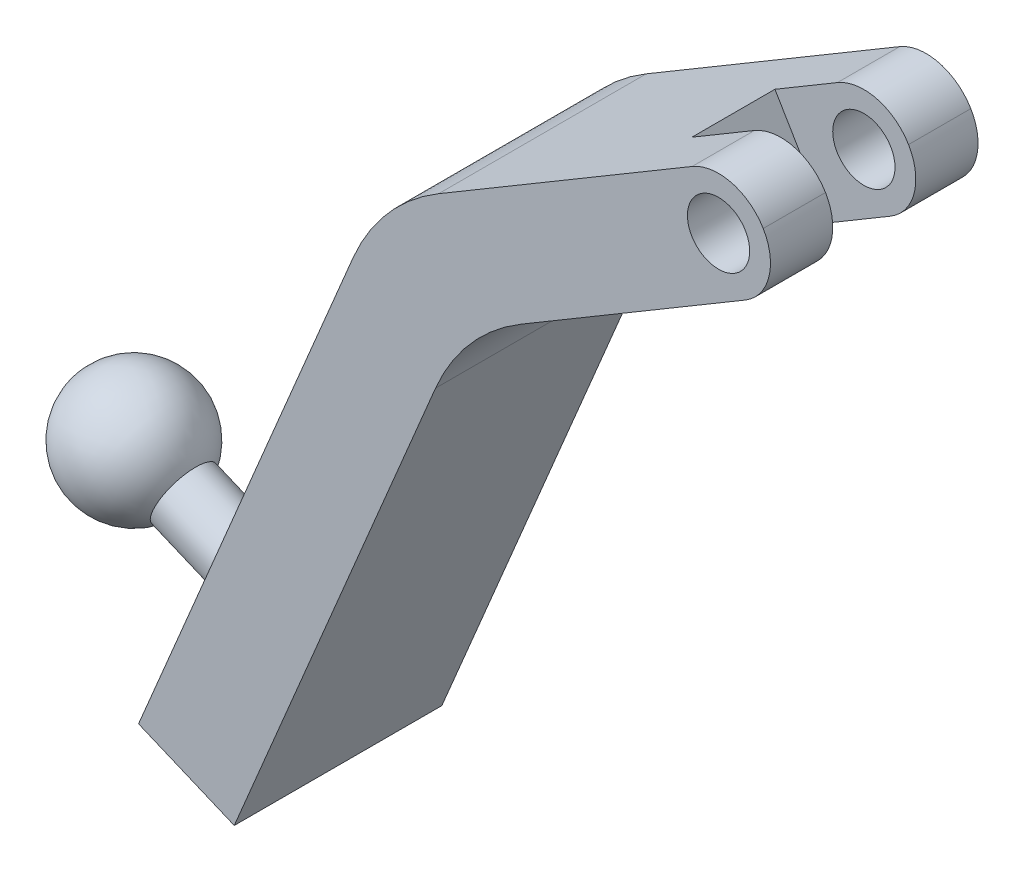
ISO-10303-21;
HEADER;
FILE_DESCRIPTION(('STEP AP214'),'2;1');
FILE_NAME('part.step','',(''),(''),'','','');
FILE_SCHEMA(('AUTOMOTIVE_DESIGN { 1 0 10303 214 1 1 1 1 }'));
ENDSEC;
DATA;
#1=APPLICATION_CONTEXT('core data for automotive mechanical design processes');
#2=APPLICATION_PROTOCOL_DEFINITION('international standard','automotive_design',2000,#1);
#3=PRODUCT_CONTEXT('',#1,'mechanical');
#4=PRODUCT('Part','Part','',(#3));
#5=PRODUCT_RELATED_PRODUCT_CATEGORY('part','',(#4));
#6=PRODUCT_DEFINITION_FORMATION('','',#4);
#7=PRODUCT_DEFINITION_CONTEXT('part definition',#1,'design');
#8=PRODUCT_DEFINITION('design','',#6,#7);
#9=PRODUCT_DEFINITION_SHAPE('','',#8);
#10=(LENGTH_UNIT() NAMED_UNIT(*) SI_UNIT(.MILLI.,.METRE.));
#11=(NAMED_UNIT(*) PLANE_ANGLE_UNIT() SI_UNIT($,.RADIAN.));
#12=(NAMED_UNIT(*) SI_UNIT($,.STERADIAN.) SOLID_ANGLE_UNIT());
#13=UNCERTAINTY_MEASURE_WITH_UNIT(LENGTH_MEASURE(1.E-05),#10,'distance_accuracy_value','');
#14=(GEOMETRIC_REPRESENTATION_CONTEXT(3) GLOBAL_UNCERTAINTY_ASSIGNED_CONTEXT((#13)) GLOBAL_UNIT_ASSIGNED_CONTEXT((#10,
#11,#12)) REPRESENTATION_CONTEXT('',''));
#15=CARTESIAN_POINT('',(0.,0.,0.));
#16=DIRECTION('',(0.,0.,1.));
#17=DIRECTION('',(1.,0.,0.));
#18=AXIS2_PLACEMENT_3D('',#15,#16,#17);
#19=CARTESIAN_POINT('',(23.9362316244768,18.0931882539563,-10.));
#20=DIRECTION('',(0.,0.,1.));
#21=DIRECTION('',(1.,0.,0.));
#22=AXIS2_PLACEMENT_3D('',#19,#20,#21);
#23=CYLINDRICAL_SURFACE('',#22,20.);
#24=DIRECTION('',(0.,0.,1.));
#25=VECTOR('',#24,1.);
#26=CARTESIAN_POINT('',(5.49586212329925,25.8361058345612,-10.));
#27=LINE('',#26,#25);
#28=CARTESIAN_POINT('',(5.49586212329925,25.8361058345612,-10.));
#29=VERTEX_POINT('',#28);
#30=CARTESIAN_POINT('',(5.49586212329925,25.8361058345612,10.));
#31=VERTEX_POINT('',#30);
#32=EDGE_CURVE('E241',#29,#31,#27,.T.);
#33=ORIENTED_EDGE('',*,*,#32,.T.);
#34=CARTESIAN_POINT('',(23.9362316244768,18.0931882539563,10.));
#35=DIRECTION('',(0.,0.,-1.));
#36=DIRECTION('',(-1.,0.,0.));
#37=AXIS2_PLACEMENT_3D('',#34,#35,#36);
#38=CIRCLE('',#37,20.);
#39=CARTESIAN_POINT('',(13.7347012801408,35.2957688346015,10.));
#40=VERTEX_POINT('',#39);
#41=EDGE_CURVE('E186',#31,#40,#38,.T.);
#42=ORIENTED_EDGE('',*,*,#41,.T.);
#43=DIRECTION('',(0.,0.,1.));
#44=VECTOR('',#43,1.);
#45=CARTESIAN_POINT('',(13.7347012801408,35.2957688346015,-10.));
#46=LINE('',#45,#44);
#47=CARTESIAN_POINT('',(13.7347012801408,35.2957688346015,-10.));
#48=VERTEX_POINT('',#47);
#49=EDGE_CURVE('E256',#48,#40,#46,.T.);
#50=ORIENTED_EDGE('',*,*,#49,.F.);
#51=CARTESIAN_POINT('',(23.9362316244768,18.0931882539563,-10.));
#52=DIRECTION('',(0.,0.,-1.));
#53=DIRECTION('',(-1.,0.,0.));
#54=AXIS2_PLACEMENT_3D('',#51,#52,#53);
#55=CIRCLE('',#54,20.);
#56=EDGE_CURVE('E214',#29,#48,#55,.T.);
#57=ORIENTED_EDGE('',*,*,#56,.F.);
#58=EDGE_LOOP('',(#33,#42,#50,#57));
#59=FACE_BOUND('',#58,.T.);
#60=ADVANCED_FACE('F46',(#59),#23,.T.);
#61=CARTESIAN_POINT('',(42.4583044476645,52.3295335037144,-10.));
#62=DIRECTION('',(-0.510076517216805,0.860129029032258,0.));
#63=DIRECTION('',(-0.860129029032258,-0.510076517216805,0.));
#64=AXIS2_PLACEMENT_3D('',#61,#62,#63);
#65=PLANE('',#64);
#66=DIRECTION('',(-0.860129029032258,-0.510076517216805,0.));
#67=VECTOR('',#66,1.);
#68=CARTESIAN_POINT('',(42.4583044476645,52.3295335037144,10.));
#69=LINE('',#68,#67);
#70=CARTESIAN_POINT('',(38.1576593025032,49.7791509176304,10.));
#71=VERTEX_POINT('',#70);
#72=EDGE_CURVE('E191',#71,#40,#69,.T.);
#73=ORIENTED_EDGE('',*,*,#72,.F.);
#74=DIRECTION('',(0.,0.,1.));
#75=VECTOR('',#74,1.);
#76=CARTESIAN_POINT('',(38.1576593025032,49.7791509176304,4.));
#77=LINE('',#76,#75);
#78=CARTESIAN_POINT('',(38.1576593025032,49.7791509176304,4.));
#79=VERTEX_POINT('',#78);
#80=EDGE_CURVE('E301',#71,#79,#77,.F.);
#81=ORIENTED_EDGE('',*,*,#80,.T.);
#82=DIRECTION('',(0.860129029032258,0.510076517216805,0.));
#83=VECTOR('',#82,1.);
#84=CARTESIAN_POINT('',(46.5682797361161,54.7668444305869,4.));
#85=LINE('',#84,#83);
#86=CARTESIAN_POINT('',(32.1367560992774,46.2086152971128,4.));
#87=VERTEX_POINT('',#86);
#88=EDGE_CURVE('E174',#87,#79,#85,.T.);
#89=ORIENTED_EDGE('',*,*,#88,.F.);
#90=DIRECTION('',(0.,0.,1.));
#91=VECTOR('',#90,1.);
#92=CARTESIAN_POINT('',(32.1367560992774,46.2086152971128,-4.));
#93=LINE('',#92,#91);
#94=CARTESIAN_POINT('',(32.1367560992774,46.2086152971128,-4.));
#95=VERTEX_POINT('',#94);
#96=EDGE_CURVE('E161',#95,#87,#93,.T.);
#97=ORIENTED_EDGE('',*,*,#96,.F.);
#98=DIRECTION('',(-0.860129029032258,-0.510076517216805,0.));
#99=VECTOR('',#98,1.);
#100=CARTESIAN_POINT('',(46.5682797361161,54.7668444305869,-4.));
#101=LINE('',#100,#99);
#102=CARTESIAN_POINT('',(38.1576593025032,49.7791509176304,-4.));
#103=VERTEX_POINT('',#102);
#104=EDGE_CURVE('E149',#103,#95,#101,.T.);
#105=ORIENTED_EDGE('',*,*,#104,.F.);
#106=DIRECTION('',(0.,0.,1.));
#107=VECTOR('',#106,1.);
#108=CARTESIAN_POINT('',(38.1576593025032,49.7791509176304,-10.));
#109=LINE('',#108,#107);
#110=CARTESIAN_POINT('',(38.1576593025032,49.7791509176304,-10.));
#111=VERTEX_POINT('',#110);
#112=EDGE_CURVE('E298',#103,#111,#109,.F.);
#113=ORIENTED_EDGE('',*,*,#112,.T.);
#114=DIRECTION('',(-0.860129029032258,-0.510076517216805,0.));
#115=VECTOR('',#114,1.);
#116=CARTESIAN_POINT('',(42.4583044476645,52.3295335037144,-10.));
#117=LINE('',#116,#115);
#118=EDGE_CURVE('E218',#111,#48,#117,.T.);
#119=ORIENTED_EDGE('',*,*,#118,.T.);
#120=ORIENTED_EDGE('',*,*,#49,.T.);
#121=EDGE_LOOP('',(#73,#81,#89,#97,#105,#113,#119,#120));
#122=FACE_BOUND('',#121,.T.);
#123=ADVANCED_FACE('F177',(#122),#65,.T.);
#124=CARTESIAN_POINT('',(21.6762454491921,28.3791265540586,-10.));
#125=DIRECTION('',(0.510076517216804,-0.860129029032258,0.));
#126=DIRECTION('',(0.860129029032258,0.510076517216804,0.));
#127=AXIS2_PLACEMENT_3D('',#124,#125,#126);
#128=PLANE('',#127);
#129=DIRECTION('',(-0.860129029032258,-0.510076517216804,0.));
#130=VECTOR('',#129,1.);
#131=CARTESIAN_POINT('',(21.6762454491921,28.3791265540586,4.));
#132=LINE('',#131,#130);
#133=CARTESIAN_POINT('',(43.2584244746712,41.1778606273078,4.));
#134=VERTEX_POINT('',#133);
#135=CARTESIAN_POINT('',(37.2375212714454,37.6073250067902,4.));
#136=VERTEX_POINT('',#135);
#137=EDGE_CURVE('E265',#134,#136,#132,.T.);
#138=ORIENTED_EDGE('',*,*,#137,.F.);
#139=DIRECTION('',(0.,0.,1.));
#140=VECTOR('',#139,1.);
#141=CARTESIAN_POINT('',(43.2584244746712,41.1778606273078,10.));
#142=LINE('',#141,#140);
#143=CARTESIAN_POINT('',(43.2584244746712,41.1778606273078,10.));
#144=VERTEX_POINT('',#143);
#145=EDGE_CURVE('E282',#134,#144,#142,.T.);
#146=ORIENTED_EDGE('',*,*,#145,.T.);
#147=DIRECTION('',(0.860129029032258,0.510076517216804,0.));
#148=VECTOR('',#147,1.);
#149=CARTESIAN_POINT('',(21.6762454491921,28.3791265540586,10.));
#150=LINE('',#149,#148);
#151=CARTESIAN_POINT('',(21.6762454491921,28.3791265540586,10.));
#152=VERTEX_POINT('',#151);
#153=EDGE_CURVE('E194',#152,#144,#150,.T.);
#154=ORIENTED_EDGE('',*,*,#153,.F.);
#155=DIRECTION('',(0.,0.,1.));
#156=VECTOR('',#155,1.);
#157=CARTESIAN_POINT('',(21.6762454491921,28.3791265540586,-10.));
#158=LINE('',#157,#156);
#159=CARTESIAN_POINT('',(21.6762454491921,28.3791265540586,-10.));
#160=VERTEX_POINT('',#159);
#161=EDGE_CURVE('E253',#160,#152,#158,.T.);
#162=ORIENTED_EDGE('',*,*,#161,.F.);
#163=DIRECTION('',(0.860129029032258,0.510076517216804,0.));
#164=VECTOR('',#163,1.);
#165=CARTESIAN_POINT('',(21.6762454491921,28.3791265540586,-10.));
#166=LINE('',#165,#164);
#167=CARTESIAN_POINT('',(43.2584244746712,41.1778606273078,-10.));
#168=VERTEX_POINT('',#167);
#169=EDGE_CURVE('E221',#160,#168,#166,.T.);
#170=ORIENTED_EDGE('',*,*,#169,.T.);
#171=DIRECTION('',(0.,0.,1.));
#172=VECTOR('',#171,1.);
#173=CARTESIAN_POINT('',(43.2584244746712,41.1778606273078,-4.));
#174=LINE('',#173,#172);
#175=CARTESIAN_POINT('',(43.2584244746712,41.1778606273078,-4.));
#176=VERTEX_POINT('',#175);
#177=EDGE_CURVE('E268',#168,#176,#174,.T.);
#178=ORIENTED_EDGE('',*,*,#177,.T.);
#179=DIRECTION('',(0.860129029032258,0.510076517216804,0.));
#180=VECTOR('',#179,1.);
#181=CARTESIAN_POINT('',(21.6762454491921,28.3791265540586,-4.));
#182=LINE('',#181,#180);
#183=CARTESIAN_POINT('',(37.2375212714454,37.6073250067902,-4.));
#184=VERTEX_POINT('',#183);
#185=EDGE_CURVE('E260',#184,#176,#182,.T.);
#186=ORIENTED_EDGE('',*,*,#185,.F.);
#187=DIRECTION('',(0.,0.,-1.));
#188=VECTOR('',#187,1.);
#189=CARTESIAN_POINT('',(37.2375212714454,37.6073250067902,-10.));
#190=LINE('',#189,#188);
#191=EDGE_CURVE('E170',#136,#184,#190,.T.);
#192=ORIENTED_EDGE('',*,*,#191,.F.);
#193=EDGE_LOOP('',(#138,#146,#154,#162,#170,#178,#186,#192));
#194=FACE_BOUND('',#193,.T.);
#195=ADVANCED_FACE('F325',(#194),#128,.T.);
#196=CARTESIAN_POINT('',(31.8777757935281,11.1765459734134,-10.));
#197=DIRECTION('',(0.,0.,1.));
#198=DIRECTION('',(1.,0.,0.));
#199=AXIS2_PLACEMENT_3D('',#196,#197,#198);
#200=CYLINDRICAL_SURFACE('',#199,20.);
#201=ORIENTED_EDGE('',*,*,#161,.T.);
#202=CARTESIAN_POINT('',(31.8777757935281,11.1765459734134,10.));
#203=DIRECTION('',(0.,0.,-1.));
#204=DIRECTION('',(-1.,0.,0.));
#205=AXIS2_PLACEMENT_3D('',#202,#203,#204);
#206=CIRCLE('',#205,20.);
#207=CARTESIAN_POINT('',(13.4374062923506,18.9194635540182,10.));
#208=VERTEX_POINT('',#207);
#209=EDGE_CURVE('E198',#208,#152,#206,.T.);
#210=ORIENTED_EDGE('',*,*,#209,.F.);
#211=DIRECTION('',(0.,0.,1.));
#212=VECTOR('',#211,1.);
#213=CARTESIAN_POINT('',(13.4374062923506,18.9194635540182,-10.));
#214=LINE('',#213,#212);
#215=CARTESIAN_POINT('',(13.4374062923506,18.9194635540182,-10.));
#216=VERTEX_POINT('',#215);
#217=EDGE_CURVE('E250',#216,#208,#214,.T.);
#218=ORIENTED_EDGE('',*,*,#217,.F.);
#219=CARTESIAN_POINT('',(31.8777757935281,11.1765459734134,-10.));
#220=DIRECTION('',(0.,0.,-1.));
#221=DIRECTION('',(-1.,0.,0.));
#222=AXIS2_PLACEMENT_3D('',#219,#220,#221);
#223=CIRCLE('',#222,20.);
#224=EDGE_CURVE('E225',#216,#160,#223,.T.);
#225=ORIENTED_EDGE('',*,*,#224,.T.);
#226=EDGE_LOOP('',(#201,#210,#218,#225));
#227=FACE_BOUND('',#226,.T.);
#228=ADVANCED_FACE('F329',(#227),#200,.F.);
#229=CARTESIAN_POINT('',(-5.95542470485186,-27.2660944787929,-10.));
#230=DIRECTION('',(0.922018475058877,-0.387145879030246,0.));
#231=DIRECTION('',(0.387145879030246,0.922018475058877,0.));
#232=AXIS2_PLACEMENT_3D('',#229,#230,#231);
#233=PLANE('',#232);
#234=ORIENTED_EDGE('',*,*,#217,.T.);
#235=DIRECTION('',(0.387145879030246,0.922018475058877,0.));
#236=VECTOR('',#235,1.);
#237=CARTESIAN_POINT('',(-5.95542470485186,-27.2660944787929,10.));
#238=LINE('',#237,#236);
#239=CARTESIAN_POINT('',(-5.95542470485186,-27.2660944787929,10.));
#240=VERTEX_POINT('',#239);
#241=EDGE_CURVE('E202',#240,#208,#238,.T.);
#242=ORIENTED_EDGE('',*,*,#241,.F.);
#243=DIRECTION('',(0.,0.,1.));
#244=VECTOR('',#243,1.);
#245=CARTESIAN_POINT('',(-5.95542470485186,-27.2660944787929,-10.));
#246=LINE('',#245,#244);
#247=CARTESIAN_POINT('',(-5.95542470485186,-27.2660944787929,-10.));
#248=VERTEX_POINT('',#247);
#249=EDGE_CURVE('E247',#248,#240,#246,.T.);
#250=ORIENTED_EDGE('',*,*,#249,.F.);
#251=DIRECTION('',(0.387145879030246,0.922018475058877,0.));
#252=VECTOR('',#251,1.);
#253=CARTESIAN_POINT('',(-5.95542470485186,-27.2660944787929,-10.));
#254=LINE('',#253,#252);
#255=EDGE_CURVE('E229',#248,#216,#254,.T.);
#256=ORIENTED_EDGE('',*,*,#255,.T.);
#257=EDGE_LOOP('',(#234,#242,#250,#256));
#258=FACE_BOUND('',#257,.T.);
#259=ADVANCED_FACE('F335',(#258),#233,.T.);
#260=CARTESIAN_POINT('',(-15.1756094554406,-23.3946356884904,-10.));
#261=DIRECTION('',(-0.387145879030246,-0.922018475058878,0.));
#262=DIRECTION('',(0.922018475058878,-0.387145879030246,0.));
#263=AXIS2_PLACEMENT_3D('',#260,#261,#262);
#264=PLANE('',#263);
#265=ORIENTED_EDGE('',*,*,#249,.T.);
#266=DIRECTION('',(0.922018475058878,-0.387145879030246,0.));
#267=VECTOR('',#266,1.);
#268=CARTESIAN_POINT('',(-15.1756094554406,-23.3946356884904,10.));
#269=LINE('',#268,#267);
#270=CARTESIAN_POINT('',(-15.1756094554406,-23.3946356884904,10.));
#271=VERTEX_POINT('',#270);
#272=EDGE_CURVE('E205',#271,#240,#269,.T.);
#273=ORIENTED_EDGE('',*,*,#272,.F.);
#274=DIRECTION('',(0.,0.,1.));
#275=VECTOR('',#274,1.);
#276=CARTESIAN_POINT('',(-15.1756094554406,-23.3946356884904,-10.));
#277=LINE('',#276,#275);
#278=CARTESIAN_POINT('',(-15.1756094554406,-23.3946356884904,-10.));
#279=VERTEX_POINT('',#278);
#280=EDGE_CURVE('E244',#279,#271,#277,.T.);
#281=ORIENTED_EDGE('',*,*,#280,.F.);
#282=DIRECTION('',(0.922018475058878,-0.387145879030246,0.));
#283=VECTOR('',#282,1.);
#284=CARTESIAN_POINT('',(-15.1756094554406,-23.3946356884904,-10.));
#285=LINE('',#284,#283);
#286=EDGE_CURVE('E233',#279,#248,#285,.T.);
#287=ORIENTED_EDGE('',*,*,#286,.T.);
#288=EDGE_LOOP('',(#265,#273,#281,#287));
#289=FACE_BOUND('',#288,.T.);
#290=ADVANCED_FACE('F340',(#289),#264,.T.);
#291=CARTESIAN_POINT('',(5.49586212329925,25.8361058345612,-10.));
#292=DIRECTION('',(-0.922018475058877,0.387145879030247,0.));
#293=DIRECTION('',(-0.387145879030247,-0.922018475058877,0.));
#294=AXIS2_PLACEMENT_3D('',#291,#292,#293);
#295=PLANE('',#294);
#296=CARTESIAN_POINT('',(-11.954352320611,-15.7229575121198,0.));
#297=DIRECTION('',(-0.922018475058877,0.387145879030247,0.));
#298=DIRECTION('',(-0.387145879030247,-0.922018475058877,0.));
#299=AXIS2_PLACEMENT_3D('',#296,#297,#298);
#300=CIRCLE('',#299,3.);
#301=CARTESIAN_POINT('',(-13.1157899577017,-18.4890129372964,0.));
#302=VERTEX_POINT('',#301);
#303=EDGE_CURVE('E278',#302,#302,#300,.T.);
#304=ORIENTED_EDGE('',*,*,#303,.F.);
#305=EDGE_LOOP('',(#304));
#306=FACE_BOUND('',#305,.T.);
#307=ORIENTED_EDGE('',*,*,#280,.T.);
#308=DIRECTION('',(-0.387145879030247,-0.922018475058877,0.));
#309=VECTOR('',#308,1.);
#310=CARTESIAN_POINT('',(5.49586212329925,25.8361058345612,10.));
#311=LINE('',#310,#309);
#312=EDGE_CURVE('E210',#31,#271,#311,.T.);
#313=ORIENTED_EDGE('',*,*,#312,.F.);
#314=ORIENTED_EDGE('',*,*,#32,.F.);
#315=DIRECTION('',(-0.387145879030247,-0.922018475058877,0.));
#316=VECTOR('',#315,1.);
#317=CARTESIAN_POINT('',(5.49586212329925,25.8361058345612,-10.));
#318=LINE('',#317,#316);
#319=EDGE_CURVE('E237',#29,#279,#318,.T.);
#320=ORIENTED_EDGE('',*,*,#319,.T.);
#321=EDGE_LOOP('',(#307,#313,#314,#320));
#322=FACE_BOUND('',#321,.T.);
#323=ADVANCED_FACE('F343',(#306,#322),#295,.T.);
#324=CARTESIAN_POINT('',(23.9362316244768,18.0931882539563,-10.));
#325=DIRECTION('',(0.,0.,-1.));
#326=DIRECTION('',(-1.,0.,0.));
#327=AXIS2_PLACEMENT_3D('',#324,#325,#326);
#328=PLANE('',#327);
#329=CARTESIAN_POINT('',(40.7050188123297,45.4767130179443,-10.));
#330=DIRECTION('',(0.,0.,1.));
#331=DIRECTION('',(1.,0.,0.));
#332=AXIS2_PLACEMENT_3D('',#329,#330,#331);
#333=CIRCLE('',#332,3.);
#334=CARTESIAN_POINT('',(43.7050188123297,45.4767130179443,-10.));
#335=VERTEX_POINT('',#334);
#336=EDGE_CURVE('E273',#335,#335,#333,.T.);
#337=ORIENTED_EDGE('',*,*,#336,.T.);
#338=EDGE_LOOP('',(#337));
#339=FACE_BOUND('',#338,.T.);
#340=ORIENTED_EDGE('',*,*,#118,.F.);
#341=CARTESIAN_POINT('',(40.7080418885872,45.4785057724691,-10.));
#342=DIRECTION('',(0.,0.,-1.));
#343=DIRECTION('',(-1.,0.,0.));
#344=AXIS2_PLACEMENT_3D('',#341,#342,#343);
#345=CIRCLE('',#344,5.);
#346=CARTESIAN_POINT('',(45.0086870337485,48.0288883585531,-10.));
#347=VERTEX_POINT('',#346);
#348=EDGE_CURVE('E12',#111,#347,#345,.T.);
#349=ORIENTED_EDGE('',*,*,#348,.T.);
#350=CARTESIAN_POINT('',(40.7080418885872,45.4785057724691,-10.));
#351=DIRECTION('',(0.,0.,-1.));
#352=DIRECTION('',(-1.,0.,0.));
#353=AXIS2_PLACEMENT_3D('',#350,#351,#352);
#354=CIRCLE('',#353,5.);
#355=EDGE_CURVE('E56',#347,#168,#354,.T.);
#356=ORIENTED_EDGE('',*,*,#355,.T.);
#357=ORIENTED_EDGE('',*,*,#169,.F.);
#358=ORIENTED_EDGE('',*,*,#224,.F.);
#359=ORIENTED_EDGE('',*,*,#255,.F.);
#360=ORIENTED_EDGE('',*,*,#286,.F.);
#361=ORIENTED_EDGE('',*,*,#319,.F.);
#362=ORIENTED_EDGE('',*,*,#56,.T.);
#363=EDGE_LOOP('',(#340,#349,#356,#357,#358,#359,#360,#361,#362));
#364=FACE_BOUND('',#363,.T.);
#365=ADVANCED_FACE('F321',(#339,#364),#328,.T.);
#366=CARTESIAN_POINT('',(23.9362316244768,18.0931882539563,10.));
#367=DIRECTION('',(0.,0.,-1.));
#368=DIRECTION('',(-1.,0.,0.));
#369=AXIS2_PLACEMENT_3D('',#366,#367,#368);
#370=PLANE('',#369);
#371=CARTESIAN_POINT('',(40.7050188123297,45.4767130179443,10.));
#372=DIRECTION('',(0.,0.,1.));
#373=DIRECTION('',(1.,0.,0.));
#374=AXIS2_PLACEMENT_3D('',#371,#372,#373);
#375=CIRCLE('',#374,3.);
#376=CARTESIAN_POINT('',(43.7050188123297,45.4767130179443,10.));
#377=VERTEX_POINT('',#376);
#378=EDGE_CURVE('E415',#377,#377,#375,.T.);
#379=ORIENTED_EDGE('',*,*,#378,.F.);
#380=EDGE_LOOP('',(#379));
#381=FACE_BOUND('',#380,.T.);
#382=ORIENTED_EDGE('',*,*,#153,.T.);
#383=CARTESIAN_POINT('',(40.7080418885872,45.4785057724691,10.));
#384=DIRECTION('',(0.,0.,-1.));
#385=DIRECTION('',(-1.,0.,0.));
#386=AXIS2_PLACEMENT_3D('',#383,#384,#385);
#387=CIRCLE('',#386,5.);
#388=CARTESIAN_POINT('',(45.0086870337485,48.0288883585531,10.));
#389=VERTEX_POINT('',#388);
#390=EDGE_CURVE('E289',#144,#389,#387,.F.);
#391=ORIENTED_EDGE('',*,*,#390,.T.);
#392=CARTESIAN_POINT('',(40.7080418885872,45.4785057724691,10.));
#393=DIRECTION('',(0.,0.,-1.));
#394=DIRECTION('',(-1.,0.,0.));
#395=AXIS2_PLACEMENT_3D('',#392,#393,#394);
#396=CIRCLE('',#395,5.);
#397=EDGE_CURVE('E286',#389,#71,#396,.F.);
#398=ORIENTED_EDGE('',*,*,#397,.T.);
#399=ORIENTED_EDGE('',*,*,#72,.T.);
#400=ORIENTED_EDGE('',*,*,#41,.F.);
#401=ORIENTED_EDGE('',*,*,#312,.T.);
#402=ORIENTED_EDGE('',*,*,#272,.T.);
#403=ORIENTED_EDGE('',*,*,#241,.T.);
#404=ORIENTED_EDGE('',*,*,#209,.T.);
#405=EDGE_LOOP('',(#382,#391,#398,#399,#400,#401,#402,#403,#404));
#406=FACE_BOUND('',#405,.T.);
#407=ADVANCED_FACE('F331',(#381,#406),#370,.F.);
#408=CARTESIAN_POINT('',(82.8165056583014,-6.3576149676078,4.));
#409=DIRECTION('',(0.,0.,1.));
#410=DIRECTION('',(1.,0.,0.));
#411=AXIS2_PLACEMENT_3D('',#408,#409,#410);
#412=PLANE('',#411);
#413=CARTESIAN_POINT('',(40.7050188123297,45.4767130179443,4.));
#414=DIRECTION('',(0.,0.,1.));
#415=DIRECTION('',(1.,0.,0.));
#416=AXIS2_PLACEMENT_3D('',#413,#414,#415);
#417=CIRCLE('',#416,3.);
#418=CARTESIAN_POINT('',(43.7050188123297,45.4767130179443,4.));
#419=VERTEX_POINT('',#418);
#420=EDGE_CURVE('E162',#419,#419,#417,.T.);
#421=ORIENTED_EDGE('',*,*,#420,.T.);
#422=EDGE_LOOP('',(#421));
#423=FACE_BOUND('',#422,.T.);
#424=CARTESIAN_POINT('',(40.7080418885872,45.4785057724691,4.));
#425=DIRECTION('',(0.,0.,1.));
#426=DIRECTION('',(1.,0.,0.));
#427=AXIS2_PLACEMENT_3D('',#424,#425,#426);
#428=CIRCLE('',#427,5.);
#429=CARTESIAN_POINT('',(45.0086870337485,48.0288883585531,4.));
#430=VERTEX_POINT('',#429);
#431=EDGE_CURVE('E292',#79,#430,#428,.F.);
#432=ORIENTED_EDGE('',*,*,#431,.T.);
#433=CARTESIAN_POINT('',(40.7080418885872,45.4785057724691,4.));
#434=DIRECTION('',(0.,0.,1.));
#435=DIRECTION('',(1.,0.,0.));
#436=AXIS2_PLACEMENT_3D('',#433,#434,#435);
#437=CIRCLE('',#436,5.);
#438=EDGE_CURVE('E295',#430,#134,#437,.F.);
#439=ORIENTED_EDGE('',*,*,#438,.T.);
#440=ORIENTED_EDGE('',*,*,#137,.T.);
#441=DIRECTION('',(-0.510076517216805,0.860129029032258,0.));
#442=VECTOR('',#441,1.);
#443=CARTESIAN_POINT('',(68.3849820214627,-14.9158441010819,4.));
#444=LINE('',#443,#442);
#445=EDGE_CURVE('E173',#136,#87,#444,.T.);
#446=ORIENTED_EDGE('',*,*,#445,.T.);
#447=ORIENTED_EDGE('',*,*,#88,.T.);
#448=EDGE_LOOP('',(#432,#439,#440,#446,#447));
#449=FACE_BOUND('',#448,.T.);
#450=ADVANCED_FACE('F354',(#423,#449),#412,.F.);
#451=CARTESIAN_POINT('',(82.8165056583014,-6.3576149676078,-4.));
#452=DIRECTION('',(0.,0.,-1.));
#453=DIRECTION('',(-1.,0.,0.));
#454=AXIS2_PLACEMENT_3D('',#451,#452,#453);
#455=PLANE('',#454);
#456=CARTESIAN_POINT('',(40.7050188123297,45.4767130179443,-4.));
#457=DIRECTION('',(0.,0.,-1.));
#458=DIRECTION('',(-1.,0.,0.));
#459=AXIS2_PLACEMENT_3D('',#456,#457,#458);
#460=CIRCLE('',#459,3.);
#461=CARTESIAN_POINT('',(37.7050188123297,45.4767130179443,-4.));
#462=VERTEX_POINT('',#461);
#463=EDGE_CURVE('E269',#462,#462,#460,.T.);
#464=ORIENTED_EDGE('',*,*,#463,.T.);
#465=EDGE_LOOP('',(#464));
#466=FACE_BOUND('',#465,.T.);
#467=CARTESIAN_POINT('',(40.7080418885872,45.4785057724691,-4.));
#468=DIRECTION('',(0.,0.,-1.));
#469=DIRECTION('',(-1.,0.,0.));
#470=AXIS2_PLACEMENT_3D('',#467,#468,#469);
#471=CIRCLE('',#470,5.);
#472=CARTESIAN_POINT('',(45.0086870337485,48.0288883585531,-4.));
#473=VERTEX_POINT('',#472);
#474=EDGE_CURVE('E70',#176,#473,#471,.F.);
#475=ORIENTED_EDGE('',*,*,#474,.T.);
#476=CARTESIAN_POINT('',(40.7080418885872,45.4785057724691,-4.));
#477=DIRECTION('',(0.,0.,-1.));
#478=DIRECTION('',(-1.,0.,0.));
#479=AXIS2_PLACEMENT_3D('',#476,#477,#478);
#480=CIRCLE('',#479,5.);
#481=EDGE_CURVE('E155',#473,#103,#480,.F.);
#482=ORIENTED_EDGE('',*,*,#481,.T.);
#483=ORIENTED_EDGE('',*,*,#104,.T.);
#484=DIRECTION('',(-0.510076517216805,0.860129029032258,0.));
#485=VECTOR('',#484,1.);
#486=CARTESIAN_POINT('',(68.3849820214627,-14.9158441010819,-4.));
#487=LINE('',#486,#485);
#488=EDGE_CURVE('E152',#184,#95,#487,.T.);
#489=ORIENTED_EDGE('',*,*,#488,.F.);
#490=ORIENTED_EDGE('',*,*,#185,.T.);
#491=EDGE_LOOP('',(#475,#482,#483,#489,#490));
#492=FACE_BOUND('',#491,.T.);
#493=ADVANCED_FACE('F151',(#466,#492),#455,.F.);
#494=CARTESIAN_POINT('',(68.3849820214627,-14.9158441010819,-4.));
#495=DIRECTION('',(-0.860129029032258,-0.510076517216805,0.));
#496=DIRECTION('',(0.510076517216805,-0.860129029032258,0.));
#497=AXIS2_PLACEMENT_3D('',#494,#495,#496);
#498=PLANE('',#497);
#499=ORIENTED_EDGE('',*,*,#191,.T.);
#500=ORIENTED_EDGE('',*,*,#488,.T.);
#501=ORIENTED_EDGE('',*,*,#96,.T.);
#502=ORIENTED_EDGE('',*,*,#445,.F.);
#503=EDGE_LOOP('',(#499,#500,#501,#502));
#504=FACE_BOUND('',#503,.T.);
#505=ADVANCED_FACE('F166',(#504),#498,.F.);
#506=CARTESIAN_POINT('',(40.7050188123297,45.4767130179443,-10.));
#507=DIRECTION('',(0.,0.,1.));
#508=DIRECTION('',(1.,0.,0.));
#509=AXIS2_PLACEMENT_3D('',#506,#507,#508);
#510=CYLINDRICAL_SURFACE('',#509,3.);
#511=ORIENTED_EDGE('',*,*,#336,.F.);
#512=EDGE_LOOP('',(#511));
#513=FACE_BOUND('',#512,.T.);
#514=ORIENTED_EDGE('',*,*,#463,.F.);
#515=EDGE_LOOP('',(#514));
#516=FACE_BOUND('',#515,.T.);
#517=ADVANCED_FACE('F394',(#513,#516),#510,.F.);
#518=ORIENTED_EDGE('',*,*,#378,.T.);
#519=EDGE_LOOP('',(#518));
#520=FACE_BOUND('',#519,.T.);
#521=ORIENTED_EDGE('',*,*,#420,.F.);
#522=EDGE_LOOP('',(#521));
#523=FACE_BOUND('',#522,.T.);
#524=ADVANCED_FACE('F398',(#520,#523),#510,.F.);
#525=CARTESIAN_POINT('',(-21.1745370711997,-11.8514987218173,0.));
#526=DIRECTION('',(0.922018475058877,-0.387145879030247,0.));
#527=DIRECTION('',(0.387145879030247,0.922018475058877,0.));
#528=AXIS2_PLACEMENT_3D('',#525,#526,#527);
#529=CYLINDRICAL_SURFACE('',#528,3.);
#530=CARTESIAN_POINT('',(-20.8368498036788,-11.9932900606659,0.));
#531=DIRECTION('',(-0.922018475058877,0.387145879030247,0.));
#532=DIRECTION('',(-0.387145879030247,-0.922018475058877,0.));
#533=AXIS2_PLACEMENT_3D('',#530,#531,#532);
#534=CIRCLE('',#533,3.);
#535=CARTESIAN_POINT('',(-21.9982874407695,-14.7593454858425,0.));
#536=VERTEX_POINT('',#535);
#537=EDGE_CURVE('E274',#536,#536,#534,.F.);
#538=ORIENTED_EDGE('',*,*,#537,.T.);
#539=EDGE_LOOP('',(#538));
#540=FACE_BOUND('',#539,.T.);
#541=ORIENTED_EDGE('',*,*,#303,.T.);
#542=EDGE_LOOP('',(#541));
#543=FACE_BOUND('',#542,.T.);
#544=ADVANCED_FACE('F401',(#540,#543),#529,.T.);
#545=CARTESIAN_POINT('',(-25.6277983366362,-9.98162106340197,0.));
#546=DIRECTION('',(0.922018475058878,-0.387145879030246,0.));
#547=DIRECTION('',(-0.387145879030246,-0.922018475058878,0.));
#548=AXIS2_PLACEMENT_3D('',#545,#546,#547);
#549=SPHERICAL_SURFACE('',#548,6.);
#550=ORIENTED_EDGE('',*,*,#537,.F.);
#551=EDGE_LOOP('',(#550));
#552=FACE_BOUND('',#551,.T.);
#553=ADVANCED_FACE('F363',(#552),#549,.T.);
#554=CARTESIAN_POINT('',(40.7080418885872,45.4785057724691,-10.));
#555=DIRECTION('',(0.,0.,-1.));
#556=DIRECTION('',(-1.,0.,0.));
#557=AXIS2_PLACEMENT_3D('',#554,#555,#556);
#558=CYLINDRICAL_SURFACE('',#557,5.);
#559=DIRECTION('',(0.,0.,1.));
#560=VECTOR('',#559,1.);
#561=CARTESIAN_POINT('',(45.0086870337485,48.0288883585531,10.));
#562=LINE('',#561,#560);
#563=EDGE_CURVE('E279',#430,#389,#562,.T.);
#564=ORIENTED_EDGE('',*,*,#563,.F.);
#565=ORIENTED_EDGE('',*,*,#431,.F.);
#566=ORIENTED_EDGE('',*,*,#80,.F.);
#567=ORIENTED_EDGE('',*,*,#397,.F.);
#568=EDGE_LOOP('',(#564,#565,#566,#567));
#569=FACE_BOUND('',#568,.T.);
#570=ADVANCED_FACE('F352',(#569),#558,.T.);
#571=CARTESIAN_POINT('',(40.7080418885872,45.4785057724691,-10.));
#572=DIRECTION('',(0.,0.,-1.));
#573=DIRECTION('',(-1.,0.,0.));
#574=AXIS2_PLACEMENT_3D('',#571,#572,#573);
#575=CYLINDRICAL_SURFACE('',#574,5.);
#576=ORIENTED_EDGE('',*,*,#438,.F.);
#577=ORIENTED_EDGE('',*,*,#563,.T.);
#578=ORIENTED_EDGE('',*,*,#390,.F.);
#579=ORIENTED_EDGE('',*,*,#145,.F.);
#580=EDGE_LOOP('',(#576,#577,#578,#579));
#581=FACE_BOUND('',#580,.T.);
#582=ADVANCED_FACE('F356',(#581),#575,.T.);
#583=CARTESIAN_POINT('',(40.7080418885872,45.4785057724691,-10.));
#584=DIRECTION('',(0.,0.,-1.));
#585=DIRECTION('',(-1.,0.,0.));
#586=AXIS2_PLACEMENT_3D('',#583,#584,#585);
#587=CYLINDRICAL_SURFACE('',#586,5.);
#588=ORIENTED_EDGE('',*,*,#177,.F.);
#589=ORIENTED_EDGE('',*,*,#355,.F.);
#590=DIRECTION('',(0.,0.,1.));
#591=VECTOR('',#590,1.);
#592=CARTESIAN_POINT('',(45.0086870337485,48.0288883585531,-10.));
#593=LINE('',#592,#591);
#594=EDGE_CURVE('E50',#473,#347,#593,.F.);
#595=ORIENTED_EDGE('',*,*,#594,.F.);
#596=ORIENTED_EDGE('',*,*,#474,.F.);
#597=EDGE_LOOP('',(#588,#589,#595,#596));
#598=FACE_BOUND('',#597,.T.);
#599=ADVANCED_FACE('F48',(#598),#587,.T.);
#600=CARTESIAN_POINT('',(40.7080418885872,45.4785057724691,-10.));
#601=DIRECTION('',(0.,0.,-1.));
#602=DIRECTION('',(-1.,0.,0.));
#603=AXIS2_PLACEMENT_3D('',#600,#601,#602);
#604=CYLINDRICAL_SURFACE('',#603,5.);
#605=ORIENTED_EDGE('',*,*,#348,.F.);
#606=ORIENTED_EDGE('',*,*,#112,.F.);
#607=ORIENTED_EDGE('',*,*,#481,.F.);
#608=ORIENTED_EDGE('',*,*,#594,.T.);
#609=EDGE_LOOP('',(#605,#606,#607,#608));
#610=FACE_BOUND('',#609,.T.);
#611=ADVANCED_FACE('F317',(#610),#604,.T.);
#612=CLOSED_SHELL('',(#60,#123,#195,#228,#259,#290,#323,#365,#407,#450,#493,#505,#517,#524,#544,
#553,#570,#582,#599,#611));
#613=MANIFOLD_SOLID_BREP('B2',#612);
#614=ADVANCED_BREP_SHAPE_REPRESENTATION('',(#18,#613),#14);
#615=SHAPE_DEFINITION_REPRESENTATION(#9,#614);
ENDSEC;
END-ISO-10303-21;
